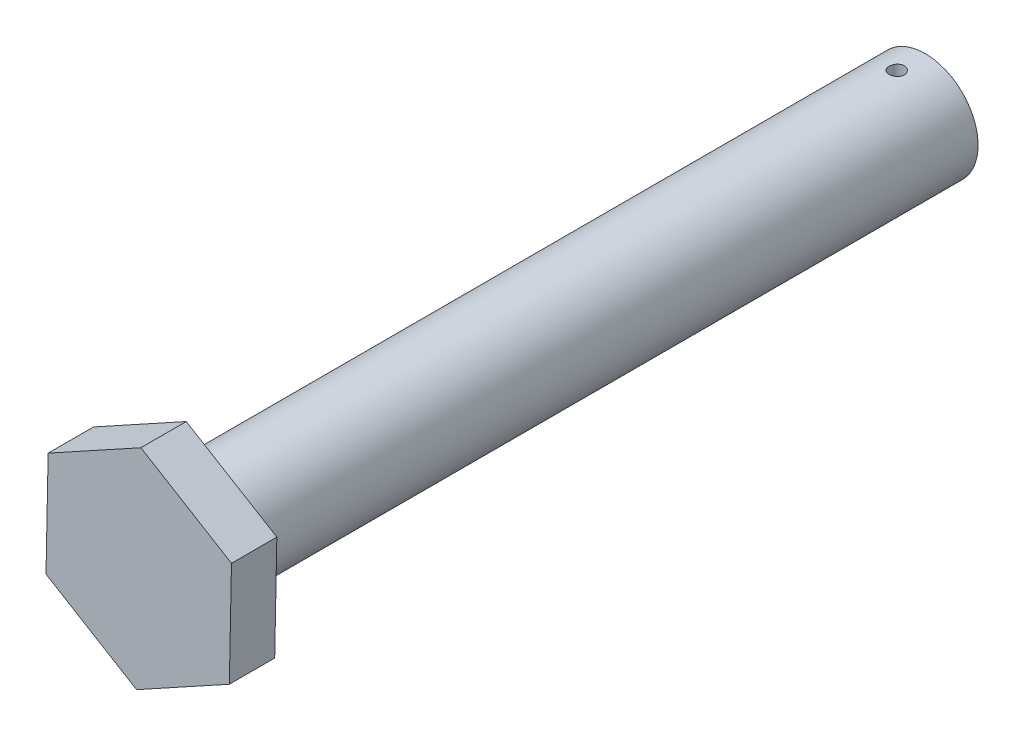
ISO-10303-21;
HEADER;
FILE_DESCRIPTION(('STEP AP214'),'2;1');
FILE_NAME('part.step','',(''),(''),'','','');
FILE_SCHEMA(('AUTOMOTIVE_DESIGN { 1 0 10303 214 1 1 1 1 }'));
ENDSEC;
DATA;
#1=APPLICATION_CONTEXT('core data for automotive mechanical design processes');
#2=APPLICATION_PROTOCOL_DEFINITION('international standard','automotive_design',2000,#1);
#3=PRODUCT_CONTEXT('',#1,'mechanical');
#4=PRODUCT('Part','Part','',(#3));
#5=PRODUCT_RELATED_PRODUCT_CATEGORY('part','',(#4));
#6=PRODUCT_DEFINITION_FORMATION('','',#4);
#7=PRODUCT_DEFINITION_CONTEXT('part definition',#1,'design');
#8=PRODUCT_DEFINITION('design','',#6,#7);
#9=PRODUCT_DEFINITION_SHAPE('','',#8);
#10=(LENGTH_UNIT() NAMED_UNIT(*) SI_UNIT(.MILLI.,.METRE.));
#11=(NAMED_UNIT(*) PLANE_ANGLE_UNIT() SI_UNIT($,.RADIAN.));
#12=(NAMED_UNIT(*) SI_UNIT($,.STERADIAN.) SOLID_ANGLE_UNIT());
#13=UNCERTAINTY_MEASURE_WITH_UNIT(LENGTH_MEASURE(1.E-05),#10,'distance_accuracy_value','');
#14=(GEOMETRIC_REPRESENTATION_CONTEXT(3) GLOBAL_UNCERTAINTY_ASSIGNED_CONTEXT((#13)) GLOBAL_UNIT_ASSIGNED_CONTEXT((#10,
#11,#12)) REPRESENTATION_CONTEXT('',''));
#15=CARTESIAN_POINT('',(0.,0.,0.));
#16=DIRECTION('',(0.,0.,1.));
#17=DIRECTION('',(1.,0.,0.));
#18=AXIS2_PLACEMENT_3D('',#15,#16,#17);
#19=CARTESIAN_POINT('',(0.,0.,46.));
#20=DIRECTION('',(0.,0.,-1.));
#21=DIRECTION('',(-1.,0.,0.));
#22=AXIS2_PLACEMENT_3D('',#19,#20,#21);
#23=CYLINDRICAL_SURFACE('',#22,3.5);
#24=CARTESIAN_POINT('',(0.,-3.5,-0.612079682125669));
#25=CARTESIAN_POINT('',(0.0279326823532053,-3.49999956761441,-0.612080845420074));
#26=CARTESIAN_POINT('',(0.0558819527477583,-3.49966210100148,-0.61442828570537));
#27=CARTESIAN_POINT('',(0.11100033018404,-3.49834835252939,-0.623754250242666));
#28=CARTESIAN_POINT('',(0.138168632766739,-3.49737143498153,-0.630737383010859));
#29=CARTESIAN_POINT('',(0.190919338392721,-3.49488865080911,-0.649122712992783));
#30=CARTESIAN_POINT('',(0.216502884674885,-3.49338317084148,-0.660521680538921));
#31=CARTESIAN_POINT('',(0.265389825120159,-3.49000994540293,-0.687407453573347));
#32=CARTESIAN_POINT('',(0.288693557719325,-3.48814225382512,-0.702893651050459));
#33=CARTESIAN_POINT('',(0.332529325198656,-3.48423769560446,-0.737631767709302));
#34=CARTESIAN_POINT('',(0.353042795400325,-3.48219982883739,-0.756907003554626));
#35=CARTESIAN_POINT('',(0.390555645884314,-3.47819249910609,-0.798625889395497));
#36=CARTESIAN_POINT('',(0.407554831354348,-3.47622303993902,-0.821069714923929));
#37=CARTESIAN_POINT('',(0.437627938211114,-3.47256578245342,-0.868612240152546));
#38=CARTESIAN_POINT('',(0.450684062736942,-3.47087927599814,-0.893722305268245));
#39=CARTESIAN_POINT('',(0.472386725834049,-3.46799241328143,-0.945806951871196));
#40=CARTESIAN_POINT('',(0.481033482272492,-3.46679203300108,-0.97278144116233));
#41=CARTESIAN_POINT('',(0.493614660030584,-3.46502309688297,-1.02763468703968));
#42=CARTESIAN_POINT('',(0.497580744263977,-3.46445029761801,-1.05550604208958));
#43=CARTESIAN_POINT('',(0.500786050037842,-3.46398846922711,-1.11152413484307));
#44=CARTESIAN_POINT('',(0.500025518134895,-3.46409940443521,-1.13967085810603));
#45=CARTESIAN_POINT('',(0.493825090489705,-3.46498862885515,-1.1952179547922));
#46=CARTESIAN_POINT('',(0.488420340898247,-3.4657619055106,-1.22262234314859));
#47=CARTESIAN_POINT('',(0.473139861607143,-3.46788085844754,-1.2761312252678));
#48=CARTESIAN_POINT('',(0.463264016237406,-3.4692265495377,-1.30223568538125));
#49=CARTESIAN_POINT('',(0.439284760624768,-3.47234428867639,-1.35251131867988));
#50=CARTESIAN_POINT('',(0.42516634655817,-3.47411784540628,-1.37667523831857));
#51=CARTESIAN_POINT('',(0.39311342286019,-3.47789036945032,-1.42230428822032));
#52=CARTESIAN_POINT('',(0.375178685756276,-3.47988935019758,-1.44376925749064));
#53=CARTESIAN_POINT('',(0.335808729357195,-3.48390967840225,-1.48359488368298));
#54=CARTESIAN_POINT('',(0.314343268788805,-3.48593106442266,-1.50192565465565));
#55=CARTESIAN_POINT('',(0.268624579700444,-3.48975158947797,-1.5347289327373));
#56=CARTESIAN_POINT('',(0.244371340936245,-3.49155072769612,-1.54920142566765));
#57=CARTESIAN_POINT('',(0.193740519906922,-3.49472567656735,-1.57387840087531));
#58=CARTESIAN_POINT('',(0.167361863866827,-3.4961012715301,-1.58408070949924));
#59=CARTESIAN_POINT('',(0.113241674688549,-3.49827229973009,-1.59990241678554));
#60=CARTESIAN_POINT('',(0.0855002251578205,-3.49906776851079,-1.60552209622112));
#61=CARTESIAN_POINT('',(0.0297000055974864,-3.49998423643184,-1.61197958883078));
#62=CARTESIAN_POINT('',(0.00164608488559785,-3.5001110340612,-1.61285851374279));
#63=CARTESIAN_POINT('',(-0.0542087125783237,-3.49969161816925,-1.60991848012065));
#64=CARTESIAN_POINT('',(-0.0820095963940144,-3.49914542349329,-1.6060996531344));
#65=CARTESIAN_POINT('',(-0.136445604496122,-3.49744498433075,-1.59390669672699));
#66=CARTESIAN_POINT('',(-0.16308527623003,-3.49629339682522,-1.58555246733078));
#67=CARTESIAN_POINT('',(-0.21458573600617,-3.49351093568108,-1.56454674730181));
#68=CARTESIAN_POINT('',(-0.23944644727027,-3.49188004137158,-1.55189507133088));
#69=CARTESIAN_POINT('',(-0.286864923949464,-3.48830594292734,-1.5225562278788));
#70=CARTESIAN_POINT('',(-0.309406303174492,-3.48636073712302,-1.5058428246993));
#71=CARTESIAN_POINT('',(-0.351378823701215,-3.48238111607694,-1.4688916631126));
#72=CARTESIAN_POINT('',(-0.370809801769645,-3.48034669616037,-1.4486537198545));
#73=CARTESIAN_POINT('',(-0.406158411551917,-3.47639970042426,-1.40504550688455));
#74=CARTESIAN_POINT('',(-0.422048575212094,-3.47448815387127,-1.38165286455054));
#75=CARTESIAN_POINT('',(-0.449673921884786,-3.47102117870203,-1.33250638547467));
#76=CARTESIAN_POINT('',(-0.461409208762707,-3.46946574118395,-1.30675260777776));
#77=CARTESIAN_POINT('',(-0.480348526896333,-3.4668944256544,-1.2536988559991));
#78=CARTESIAN_POINT('',(-0.487567325329926,-3.46587679094809,-1.22640424241534));
#79=CARTESIAN_POINT('',(-0.497315933000383,-3.46449152316109,-1.17097454186177));
#80=CARTESIAN_POINT('',(-0.499846033482548,-3.46412384970718,-1.14283950720625));
#81=CARTESIAN_POINT('',(-0.500138975935527,-3.46408154436269,-1.08680122549535));
#82=CARTESIAN_POINT('',(-0.497944993419515,-3.46440063580794,-1.05889819921184));
#83=CARTESIAN_POINT('',(-0.488944239626999,-3.46568231052995,-1.00386215111105));
#84=CARTESIAN_POINT('',(-0.482137473103377,-3.46664489314367,-0.976729128500411));
#85=CARTESIAN_POINT('',(-0.46411911391449,-3.46910297369378,-0.924013365847873));
#86=CARTESIAN_POINT('',(-0.452910257406503,-3.47059814054422,-0.898429674184908));
#87=CARTESIAN_POINT('',(-0.426410160507718,-3.47395336431846,-0.849499070887317));
#88=CARTESIAN_POINT('',(-0.411118807979599,-3.47581343126489,-0.826152220717821));
#89=CARTESIAN_POINT('',(-0.376729868657738,-3.47970915663223,-0.782138227493441));
#90=CARTESIAN_POINT('',(-0.357600232350913,-3.48174620565913,-0.76149624582511));
#91=CARTESIAN_POINT('',(-0.316145378330288,-3.48575455513516,-0.723699755267611));
#92=CARTESIAN_POINT('',(-0.293819416083736,-3.48772584013333,-0.706546061178546));
#93=CARTESIAN_POINT('',(-0.246475856133461,-3.49139165623141,-0.676137789116632));
#94=CARTESIAN_POINT('',(-0.221445429363574,-3.49308476279883,-0.662903018586195));
#95=CARTESIAN_POINT('',(-0.169505322092509,-3.49598939018721,-0.640844746124144));
#96=CARTESIAN_POINT('',(-0.142597651299745,-3.49720141700771,-0.632016606767573));
#97=CARTESIAN_POINT('',(-0.0963028409993892,-3.49872590751262,-0.621058785397513));
#98=CARTESIAN_POINT('',(-0.0772034747946432,-3.49920127714115,-0.617696672891108));
#99=CARTESIAN_POINT('',(-0.0387387303414156,-3.49983847164448,-0.613206729853618));
#100=CARTESIAN_POINT('',(-0.0193733549557654,-3.50000029989098,-0.612078875296051));
#101=CARTESIAN_POINT('',(0.,-3.5,-0.612079682125669));
#102=B_SPLINE_CURVE_WITH_KNOTS('',3,(#24,#25,#26,#27,#28,#29,#30,#31,#32,#33,#34,#35,#36,#37,
#38,#39,#40,#41,#42,#43,#44,#45,#46,#47,#48,#49,#50,#51,#52,#53,#54,#55,#56,#57,#58,#59,#60,#61,
#62,#63,#64,#65,#66,#67,#68,#69,#70,#71,#72,#73,#74,#75,#76,#77,#78,#79,#80,#81,#82,#83,#84,#85,
#86,#87,#88,#89,#90,#91,#92,#93,#94,#95,#96,#97,#98,#99,#100,#101),.UNSPECIFIED.,.T.,.F.,(4,2,2,
2,2,2,2,2,2,2,2,2,2,2,2,2,2,2,2,2,2,2,2,2,2,2,2,2,2,2,2,2,2,2,2,2,2,2,4),(0.,0.0837272633382192,
0.167537887997918,0.251287330348426,0.335024321252585,0.419293717144034,0.503567783207469,
0.588216720212788,0.672861474303291,0.756930296604885,0.840994733623897,0.924428541449303,
1.00786450788373,1.09159908905475,1.17533866263732,1.25983689176674,1.34433543141115,
1.42887693121915,1.51341325086312,1.59721528021521,1.68101496297015,1.76444989434235,
1.84788842451248,1.93188093996657,2.01587786188791,2.10050531181173,2.18513064603257,
2.26947782185212,2.35381975814838,2.4373941296178,2.5209684149747,2.60449083601271,
2.68801555146676,2.77226911877369,2.85654234362278,2.94123451249828,3.02583736461534,
3.0839089602894,3.14197993147703),.UNSPECIFIED.);
#103=CARTESIAN_POINT('',(0.,-3.5,-0.612079682125669));
#104=VERTEX_POINT('',#103);
#105=EDGE_CURVE('E37',#104,#104,#102,.T.);
#106=ORIENTED_EDGE('',*,*,#105,.T.);
#107=EDGE_LOOP('',(#106));
#108=FACE_BOUND('',#107,.T.);
#109=CARTESIAN_POINT('',(0.,3.5,-0.612079682125669));
#110=CARTESIAN_POINT('',(-0.0279326823532053,3.49999956761441,-0.612080845420074));
#111=CARTESIAN_POINT('',(-0.0558819527477583,3.49966210100148,-0.61442828570537));
#112=CARTESIAN_POINT('',(-0.11100033018404,3.49834835252939,-0.623754250242666));
#113=CARTESIAN_POINT('',(-0.138168632766739,3.49737143498153,-0.630737383010859));
#114=CARTESIAN_POINT('',(-0.190919338392721,3.49488865080911,-0.649122712992783));
#115=CARTESIAN_POINT('',(-0.216502884674885,3.49338317084148,-0.660521680538921));
#116=CARTESIAN_POINT('',(-0.265389825120159,3.49000994540293,-0.687407453573347));
#117=CARTESIAN_POINT('',(-0.288693557719325,3.48814225382512,-0.702893651050459));
#118=CARTESIAN_POINT('',(-0.332529325198656,3.48423769560446,-0.737631767709302));
#119=CARTESIAN_POINT('',(-0.353042795400325,3.48219982883739,-0.756907003554626));
#120=CARTESIAN_POINT('',(-0.390555645884314,3.47819249910609,-0.798625889395497));
#121=CARTESIAN_POINT('',(-0.407554831354348,3.47622303993902,-0.821069714923929));
#122=CARTESIAN_POINT('',(-0.437627938211114,3.47256578245342,-0.868612240152546));
#123=CARTESIAN_POINT('',(-0.450684062736942,3.47087927599814,-0.893722305268245));
#124=CARTESIAN_POINT('',(-0.472386725834049,3.46799241328143,-0.945806951871196));
#125=CARTESIAN_POINT('',(-0.481033482272492,3.46679203300108,-0.97278144116233));
#126=CARTESIAN_POINT('',(-0.493614660030584,3.46502309688297,-1.02763468703968));
#127=CARTESIAN_POINT('',(-0.497580744263977,3.46445029761801,-1.05550604208958));
#128=CARTESIAN_POINT('',(-0.500786050037842,3.46398846922711,-1.11152413484307));
#129=CARTESIAN_POINT('',(-0.500025518134895,3.46409940443521,-1.13967085810603));
#130=CARTESIAN_POINT('',(-0.493825090489705,3.46498862885515,-1.1952179547922));
#131=CARTESIAN_POINT('',(-0.488420340898247,3.4657619055106,-1.22262234314859));
#132=CARTESIAN_POINT('',(-0.473139861607143,3.46788085844754,-1.2761312252678));
#133=CARTESIAN_POINT('',(-0.463264016237406,3.4692265495377,-1.30223568538125));
#134=CARTESIAN_POINT('',(-0.439284760624768,3.47234428867639,-1.35251131867988));
#135=CARTESIAN_POINT('',(-0.42516634655817,3.47411784540628,-1.37667523831857));
#136=CARTESIAN_POINT('',(-0.39311342286019,3.47789036945032,-1.42230428822032));
#137=CARTESIAN_POINT('',(-0.375178685756276,3.47988935019758,-1.44376925749064));
#138=CARTESIAN_POINT('',(-0.335808729357195,3.48390967840225,-1.48359488368298));
#139=CARTESIAN_POINT('',(-0.314343268788805,3.48593106442266,-1.50192565465565));
#140=CARTESIAN_POINT('',(-0.268624579700444,3.48975158947797,-1.5347289327373));
#141=CARTESIAN_POINT('',(-0.244371340936245,3.49155072769612,-1.54920142566765));
#142=CARTESIAN_POINT('',(-0.193740519906922,3.49472567656735,-1.57387840087531));
#143=CARTESIAN_POINT('',(-0.167361863866827,3.4961012715301,-1.58408070949924));
#144=CARTESIAN_POINT('',(-0.113241674688549,3.49827229973009,-1.59990241678554));
#145=CARTESIAN_POINT('',(-0.0855002251578205,3.49906776851079,-1.60552209622112));
#146=CARTESIAN_POINT('',(-0.0297000055974864,3.49998423643184,-1.61197958883078));
#147=CARTESIAN_POINT('',(-0.00164608488559785,3.5001110340612,-1.61285851374279));
#148=CARTESIAN_POINT('',(0.0542087125783237,3.49969161816925,-1.60991848012065));
#149=CARTESIAN_POINT('',(0.0820095963940144,3.49914542349329,-1.6060996531344));
#150=CARTESIAN_POINT('',(0.136445604496122,3.49744498433075,-1.59390669672699));
#151=CARTESIAN_POINT('',(0.16308527623003,3.49629339682522,-1.58555246733078));
#152=CARTESIAN_POINT('',(0.21458573600617,3.49351093568108,-1.56454674730181));
#153=CARTESIAN_POINT('',(0.23944644727027,3.49188004137158,-1.55189507133088));
#154=CARTESIAN_POINT('',(0.286864923949464,3.48830594292734,-1.5225562278788));
#155=CARTESIAN_POINT('',(0.309406303174492,3.48636073712302,-1.5058428246993));
#156=CARTESIAN_POINT('',(0.351378823701215,3.48238111607694,-1.4688916631126));
#157=CARTESIAN_POINT('',(0.370809801769645,3.48034669616037,-1.4486537198545));
#158=CARTESIAN_POINT('',(0.406158411551917,3.47639970042426,-1.40504550688455));
#159=CARTESIAN_POINT('',(0.422048575212094,3.47448815387127,-1.38165286455054));
#160=CARTESIAN_POINT('',(0.449673921884786,3.47102117870203,-1.33250638547467));
#161=CARTESIAN_POINT('',(0.461409208762707,3.46946574118395,-1.30675260777776));
#162=CARTESIAN_POINT('',(0.480348526896333,3.4668944256544,-1.2536988559991));
#163=CARTESIAN_POINT('',(0.487567325329926,3.46587679094809,-1.22640424241534));
#164=CARTESIAN_POINT('',(0.497315933000383,3.46449152316109,-1.17097454186177));
#165=CARTESIAN_POINT('',(0.499846033482548,3.46412384970718,-1.14283950720625));
#166=CARTESIAN_POINT('',(0.500138975935527,3.46408154436269,-1.08680122549535));
#167=CARTESIAN_POINT('',(0.497944993419515,3.46440063580794,-1.05889819921184));
#168=CARTESIAN_POINT('',(0.488944239626999,3.46568231052995,-1.00386215111105));
#169=CARTESIAN_POINT('',(0.482137473103377,3.46664489314367,-0.976729128500411));
#170=CARTESIAN_POINT('',(0.46411911391449,3.46910297369378,-0.924013365847873));
#171=CARTESIAN_POINT('',(0.452910257406503,3.47059814054422,-0.898429674184908));
#172=CARTESIAN_POINT('',(0.426410160507718,3.47395336431846,-0.849499070887317));
#173=CARTESIAN_POINT('',(0.411118807979599,3.47581343126489,-0.826152220717821));
#174=CARTESIAN_POINT('',(0.376729868657738,3.47970915663223,-0.782138227493441));
#175=CARTESIAN_POINT('',(0.357600232350913,3.48174620565913,-0.76149624582511));
#176=CARTESIAN_POINT('',(0.316145378330288,3.48575455513516,-0.723699755267611));
#177=CARTESIAN_POINT('',(0.293819416083736,3.48772584013333,-0.706546061178546));
#178=CARTESIAN_POINT('',(0.246475856133461,3.49139165623141,-0.676137789116632));
#179=CARTESIAN_POINT('',(0.221445429363574,3.49308476279883,-0.662903018586195));
#180=CARTESIAN_POINT('',(0.169505322092509,3.49598939018721,-0.640844746124144));
#181=CARTESIAN_POINT('',(0.142597651299745,3.49720141700771,-0.632016606767573));
#182=CARTESIAN_POINT('',(0.0963028409993892,3.49872590751262,-0.621058785397513));
#183=CARTESIAN_POINT('',(0.0772034747946432,3.49920127714115,-0.617696672891108));
#184=CARTESIAN_POINT('',(0.0387387303414156,3.49983847164448,-0.613206729853618));
#185=CARTESIAN_POINT('',(0.0193733549557654,3.50000029989098,-0.612078875296051));
#186=CARTESIAN_POINT('',(0.,3.5,-0.612079682125669));
#187=B_SPLINE_CURVE_WITH_KNOTS('',3,(#109,#110,#111,#112,#113,#114,#115,#116,#117,#118,#119,
#120,#121,#122,#123,#124,#125,#126,#127,#128,#129,#130,#131,#132,#133,#134,#135,#136,#137,#138,
#139,#140,#141,#142,#143,#144,#145,#146,#147,#148,#149,#150,#151,#152,#153,#154,#155,#156,#157,
#158,#159,#160,#161,#162,#163,#164,#165,#166,#167,#168,#169,#170,#171,#172,#173,#174,#175,#176,
#177,#178,#179,#180,#181,#182,#183,#184,#185,#186),.UNSPECIFIED.,.T.,.F.,(4,2,2,2,2,2,2,2,2,2,2,
2,2,2,2,2,2,2,2,2,2,2,2,2,2,2,2,2,2,2,2,2,2,2,2,2,2,2,4),(0.,0.0837272633382192,
0.167537887997918,0.251287330348426,0.335024321252585,0.419293717144034,0.503567783207469,
0.588216720212788,0.672861474303291,0.756930296604885,0.840994733623897,0.924428541449303,
1.00786450788373,1.09159908905475,1.17533866263732,1.25983689176674,1.34433543141115,
1.42887693121915,1.51341325086312,1.59721528021521,1.68101496297015,1.76444989434235,
1.84788842451248,1.93188093996657,2.01587786188791,2.10050531181173,2.18513064603257,
2.26947782185212,2.35381975814838,2.4373941296178,2.5209684149747,2.60449083601271,
2.68801555146676,2.77226911877369,2.85654234362278,2.94123451249828,3.02583736461534,
3.0839089602894,3.14197993147703),.UNSPECIFIED.);
#188=CARTESIAN_POINT('',(0.,3.5,-0.612079682125669));
#189=VERTEX_POINT('',#188);
#190=EDGE_CURVE('E143',#189,#189,#187,.T.);
#191=ORIENTED_EDGE('',*,*,#190,.T.);
#192=EDGE_LOOP('',(#191));
#193=FACE_BOUND('',#192,.T.);
#194=CARTESIAN_POINT('',(0.,0.,46.));
#195=DIRECTION('',(0.,0.,1.));
#196=DIRECTION('',(1.,0.,0.));
#197=AXIS2_PLACEMENT_3D('',#194,#195,#196);
#198=CIRCLE('',#197,3.5);
#199=CARTESIAN_POINT('',(3.5,0.,46.));
#200=VERTEX_POINT('',#199);
#201=EDGE_CURVE('E11',#200,#200,#198,.T.);
#202=ORIENTED_EDGE('',*,*,#201,.F.);
#203=EDGE_LOOP('',(#202));
#204=FACE_BOUND('',#203,.T.);
#205=CARTESIAN_POINT('',(0.,0.,-3.));
#206=DIRECTION('',(0.,0.,-1.));
#207=DIRECTION('',(-1.,0.,0.));
#208=AXIS2_PLACEMENT_3D('',#205,#206,#207);
#209=CIRCLE('',#208,3.5);
#210=CARTESIAN_POINT('',(-3.5,0.,-3.));
#211=VERTEX_POINT('',#210);
#212=EDGE_CURVE('E129',#211,#211,#209,.T.);
#213=ORIENTED_EDGE('',*,*,#212,.F.);
#214=EDGE_LOOP('',(#213));
#215=FACE_BOUND('',#214,.T.);
#216=ADVANCED_FACE('F33',(#108,#193,#204,#215),#23,.T.);
#217=CARTESIAN_POINT('',(6.13194865336812,3.37627097734422,49.));
#218=DIRECTION('',(-0.517469688549495,-0.855701537589181,0.));
#219=DIRECTION('',(0.855701537589181,-0.517469688549495,0.));
#220=AXIS2_PLACEMENT_3D('',#217,#218,#219);
#221=PLANE('',#220);
#222=DIRECTION('',(-0.855701537589181,0.517469688549495,0.));
#223=VECTOR('',#222,1.);
#224=CARTESIAN_POINT('',(6.13194865336812,3.37627097734422,46.));
#225=LINE('',#224,#223);
#226=CARTESIAN_POINT('',(6.13194865336812,3.37627097734422,46.));
#227=VERTEX_POINT('',#226);
#228=CARTESIAN_POINT('',(0.142037890243855,6.99855879719068,46.));
#229=VERTEX_POINT('',#228);
#230=EDGE_CURVE('E125',#227,#229,#225,.T.);
#231=ORIENTED_EDGE('',*,*,#230,.T.);
#232=DIRECTION('',(0.,0.,-1.));
#233=VECTOR('',#232,1.);
#234=CARTESIAN_POINT('',(0.142037890243855,6.99855879719068,49.));
#235=LINE('',#234,#233);
#236=CARTESIAN_POINT('',(0.142037890243855,6.99855879719068,49.));
#237=VERTEX_POINT('',#236);
#238=EDGE_CURVE('E47',#237,#229,#235,.T.);
#239=ORIENTED_EDGE('',*,*,#238,.F.);
#240=DIRECTION('',(-0.855701537589181,0.517469688549495,0.));
#241=VECTOR('',#240,1.);
#242=CARTESIAN_POINT('',(6.13194865336812,3.37627097734422,49.));
#243=LINE('',#242,#241);
#244=CARTESIAN_POINT('',(6.13194865336812,3.37627097734422,49.));
#245=VERTEX_POINT('',#244);
#246=EDGE_CURVE('E136',#245,#237,#243,.T.);
#247=ORIENTED_EDGE('',*,*,#246,.F.);
#248=DIRECTION('',(0.,0.,-1.));
#249=VECTOR('',#248,1.);
#250=CARTESIAN_POINT('',(6.13194865336812,3.37627097734422,49.));
#251=LINE('',#250,#249);
#252=EDGE_CURVE('E121',#245,#227,#251,.T.);
#253=ORIENTED_EDGE('',*,*,#252,.T.);
#254=EDGE_LOOP('',(#231,#239,#247,#253));
#255=FACE_BOUND('',#254,.T.);
#256=ADVANCED_FACE('F177',(#255),#221,.F.);
#257=CARTESIAN_POINT('',(0.142037890243855,6.99855879719068,49.));
#258=DIRECTION('',(0.482324425334888,-0.875992664766875,0.));
#259=DIRECTION('',(0.875992664766875,0.482324425334888,0.));
#260=AXIS2_PLACEMENT_3D('',#257,#258,#259);
#261=PLANE('',#260);
#262=DIRECTION('',(-0.875992664766875,-0.482324425334888,0.));
#263=VECTOR('',#262,1.);
#264=CARTESIAN_POINT('',(0.142037890243855,6.99855879719068,46.));
#265=LINE('',#264,#263);
#266=CARTESIAN_POINT('',(-5.98991076312427,3.62228781984647,46.));
#267=VERTEX_POINT('',#266);
#268=EDGE_CURVE('E128',#229,#267,#265,.T.);
#269=ORIENTED_EDGE('',*,*,#268,.T.);
#270=DIRECTION('',(0.,0.,-1.));
#271=VECTOR('',#270,1.);
#272=CARTESIAN_POINT('',(-5.98991076312427,3.62228781984647,49.));
#273=LINE('',#272,#271);
#274=CARTESIAN_POINT('',(-5.98991076312427,3.62228781984647,49.));
#275=VERTEX_POINT('',#274);
#276=EDGE_CURVE('E140',#275,#267,#273,.T.);
#277=ORIENTED_EDGE('',*,*,#276,.F.);
#278=DIRECTION('',(-0.875992664766875,-0.482324425334888,0.));
#279=VECTOR('',#278,1.);
#280=CARTESIAN_POINT('',(0.142037890243855,6.99855879719068,49.));
#281=LINE('',#280,#279);
#282=EDGE_CURVE('E94',#237,#275,#281,.T.);
#283=ORIENTED_EDGE('',*,*,#282,.F.);
#284=ORIENTED_EDGE('',*,*,#238,.T.);
#285=EDGE_LOOP('',(#269,#277,#283,#284));
#286=FACE_BOUND('',#285,.T.);
#287=ADVANCED_FACE('F174',(#286),#261,.F.);
#288=CARTESIAN_POINT('',(-5.98991076312427,3.62228781984647,49.));
#289=DIRECTION('',(0.999794113884383,-0.0202911271776935,0.));
#290=DIRECTION('',(0.0202911271776935,0.999794113884383,0.));
#291=AXIS2_PLACEMENT_3D('',#288,#289,#290);
#292=PLANE('',#291);
#293=DIRECTION('',(-0.0202911271776935,-0.999794113884383,0.));
#294=VECTOR('',#293,1.);
#295=CARTESIAN_POINT('',(-5.98991076312427,3.62228781984647,46.));
#296=LINE('',#295,#294);
#297=CARTESIAN_POINT('',(-6.13194865336812,-3.37627097734422,46.));
#298=VERTEX_POINT('',#297);
#299=EDGE_CURVE('E131',#267,#298,#296,.T.);
#300=ORIENTED_EDGE('',*,*,#299,.T.);
#301=DIRECTION('',(0.,0.,-1.));
#302=VECTOR('',#301,1.);
#303=CARTESIAN_POINT('',(-6.13194865336812,-3.37627097734422,49.));
#304=LINE('',#303,#302);
#305=CARTESIAN_POINT('',(-6.13194865336812,-3.37627097734422,49.));
#306=VERTEX_POINT('',#305);
#307=EDGE_CURVE('E116',#306,#298,#304,.T.);
#308=ORIENTED_EDGE('',*,*,#307,.F.);
#309=DIRECTION('',(-0.0202911271776935,-0.999794113884383,0.));
#310=VECTOR('',#309,1.);
#311=CARTESIAN_POINT('',(-5.98991076312427,3.62228781984647,49.));
#312=LINE('',#311,#310);
#313=EDGE_CURVE('E107',#275,#306,#312,.T.);
#314=ORIENTED_EDGE('',*,*,#313,.F.);
#315=ORIENTED_EDGE('',*,*,#276,.T.);
#316=EDGE_LOOP('',(#300,#308,#314,#315));
#317=FACE_BOUND('',#316,.T.);
#318=ADVANCED_FACE('F171',(#317),#292,.F.);
#319=CARTESIAN_POINT('',(-6.13194865336812,-3.37627097734422,49.));
#320=DIRECTION('',(0.517469688549495,0.855701537589181,0.));
#321=DIRECTION('',(-0.855701537589181,0.517469688549495,0.));
#322=AXIS2_PLACEMENT_3D('',#319,#320,#321);
#323=PLANE('',#322);
#324=DIRECTION('',(0.855701537589181,-0.517469688549495,0.));
#325=VECTOR('',#324,1.);
#326=CARTESIAN_POINT('',(-6.13194865336812,-3.37627097734422,46.));
#327=LINE('',#326,#325);
#328=CARTESIAN_POINT('',(-0.142037890243854,-6.99855879719068,46.));
#329=VERTEX_POINT('',#328);
#330=EDGE_CURVE('E115',#298,#329,#327,.T.);
#331=ORIENTED_EDGE('',*,*,#330,.T.);
#332=DIRECTION('',(0.,0.,-1.));
#333=VECTOR('',#332,1.);
#334=CARTESIAN_POINT('',(-0.142037890243854,-6.99855879719068,49.));
#335=LINE('',#334,#333);
#336=CARTESIAN_POINT('',(-0.142037890243854,-6.99855879719068,49.));
#337=VERTEX_POINT('',#336);
#338=EDGE_CURVE('E112',#337,#329,#335,.T.);
#339=ORIENTED_EDGE('',*,*,#338,.F.);
#340=DIRECTION('',(0.855701537589181,-0.517469688549495,0.));
#341=VECTOR('',#340,1.);
#342=CARTESIAN_POINT('',(-6.13194865336812,-3.37627097734422,49.));
#343=LINE('',#342,#341);
#344=EDGE_CURVE('E101',#306,#337,#343,.T.);
#345=ORIENTED_EDGE('',*,*,#344,.F.);
#346=ORIENTED_EDGE('',*,*,#307,.T.);
#347=EDGE_LOOP('',(#331,#339,#345,#346));
#348=FACE_BOUND('',#347,.T.);
#349=ADVANCED_FACE('F113',(#348),#323,.F.);
#350=CARTESIAN_POINT('',(-0.142037890243854,-6.99855879719068,49.));
#351=DIRECTION('',(-0.482324425334888,0.875992664766875,0.));
#352=DIRECTION('',(-0.875992664766875,-0.482324425334888,0.));
#353=AXIS2_PLACEMENT_3D('',#350,#351,#352);
#354=PLANE('',#353);
#355=DIRECTION('',(0.875992664766875,0.482324425334888,0.));
#356=VECTOR('',#355,1.);
#357=CARTESIAN_POINT('',(-0.142037890243854,-6.99855879719068,46.));
#358=LINE('',#357,#356);
#359=CARTESIAN_POINT('',(5.98991076312427,-3.62228781984647,46.));
#360=VERTEX_POINT('',#359);
#361=EDGE_CURVE('E79',#329,#360,#358,.T.);
#362=ORIENTED_EDGE('',*,*,#361,.T.);
#363=DIRECTION('',(0.,0.,-1.));
#364=VECTOR('',#363,1.);
#365=CARTESIAN_POINT('',(5.98991076312427,-3.62228781984647,49.));
#366=LINE('',#365,#364);
#367=CARTESIAN_POINT('',(5.98991076312427,-3.62228781984647,49.));
#368=VERTEX_POINT('',#367);
#369=EDGE_CURVE('E117',#368,#360,#366,.T.);
#370=ORIENTED_EDGE('',*,*,#369,.F.);
#371=DIRECTION('',(0.875992664766875,0.482324425334888,0.));
#372=VECTOR('',#371,1.);
#373=CARTESIAN_POINT('',(-0.142037890243854,-6.99855879719068,49.));
#374=LINE('',#373,#372);
#375=EDGE_CURVE('E105',#337,#368,#374,.T.);
#376=ORIENTED_EDGE('',*,*,#375,.F.);
#377=ORIENTED_EDGE('',*,*,#338,.T.);
#378=EDGE_LOOP('',(#362,#370,#376,#377));
#379=FACE_BOUND('',#378,.T.);
#380=ADVANCED_FACE('F119',(#379),#354,.F.);
#381=CARTESIAN_POINT('',(5.98991076312427,-3.62228781984647,49.));
#382=DIRECTION('',(-0.999794113884383,0.0202911271776936,0.));
#383=DIRECTION('',(-0.0202911271776936,-0.999794113884383,0.));
#384=AXIS2_PLACEMENT_3D('',#381,#382,#383);
#385=PLANE('',#384);
#386=DIRECTION('',(0.0202911271776936,0.999794113884383,0.));
#387=VECTOR('',#386,1.);
#388=CARTESIAN_POINT('',(5.98991076312427,-3.62228781984647,46.));
#389=LINE('',#388,#387);
#390=EDGE_CURVE('E85',#360,#227,#389,.T.);
#391=ORIENTED_EDGE('',*,*,#390,.T.);
#392=ORIENTED_EDGE('',*,*,#252,.F.);
#393=DIRECTION('',(0.0202911271776936,0.999794113884383,0.));
#394=VECTOR('',#393,1.);
#395=CARTESIAN_POINT('',(5.98991076312427,-3.62228781984647,49.));
#396=LINE('',#395,#394);
#397=EDGE_CURVE('E56',#368,#245,#396,.T.);
#398=ORIENTED_EDGE('',*,*,#397,.F.);
#399=ORIENTED_EDGE('',*,*,#369,.T.);
#400=EDGE_LOOP('',(#391,#392,#398,#399));
#401=FACE_BOUND('',#400,.T.);
#402=ADVANCED_FACE('F161',(#401),#385,.F.);
#403=CARTESIAN_POINT('',(0.,0.,49.));
#404=DIRECTION('',(0.,0.,1.));
#405=DIRECTION('',(1.,0.,0.));
#406=AXIS2_PLACEMENT_3D('',#403,#404,#405);
#407=PLANE('',#406);
#408=ORIENTED_EDGE('',*,*,#246,.T.);
#409=ORIENTED_EDGE('',*,*,#282,.T.);
#410=ORIENTED_EDGE('',*,*,#313,.T.);
#411=ORIENTED_EDGE('',*,*,#344,.T.);
#412=ORIENTED_EDGE('',*,*,#375,.T.);
#413=ORIENTED_EDGE('',*,*,#397,.T.);
#414=EDGE_LOOP('',(#408,#409,#410,#411,#412,#413));
#415=FACE_BOUND('',#414,.T.);
#416=ADVANCED_FACE('F103',(#415),#407,.T.);
#417=CARTESIAN_POINT('',(0.,0.,46.));
#418=DIRECTION('',(0.,0.,1.));
#419=DIRECTION('',(1.,0.,0.));
#420=AXIS2_PLACEMENT_3D('',#417,#418,#419);
#421=PLANE('',#420);
#422=ORIENTED_EDGE('',*,*,#201,.T.);
#423=EDGE_LOOP('',(#422));
#424=FACE_BOUND('',#423,.T.);
#425=ORIENTED_EDGE('',*,*,#230,.F.);
#426=ORIENTED_EDGE('',*,*,#390,.F.);
#427=ORIENTED_EDGE('',*,*,#361,.F.);
#428=ORIENTED_EDGE('',*,*,#330,.F.);
#429=ORIENTED_EDGE('',*,*,#299,.F.);
#430=ORIENTED_EDGE('',*,*,#268,.F.);
#431=EDGE_LOOP('',(#425,#426,#427,#428,#429,#430));
#432=FACE_BOUND('',#431,.T.);
#433=ADVANCED_FACE('F157',(#424,#432),#421,.F.);
#434=CARTESIAN_POINT('',(0.,0.,-3.));
#435=DIRECTION('',(0.,0.,-1.));
#436=DIRECTION('',(-1.,0.,0.));
#437=AXIS2_PLACEMENT_3D('',#434,#435,#436);
#438=PLANE('',#437);
#439=ORIENTED_EDGE('',*,*,#212,.T.);
#440=EDGE_LOOP('',(#439));
#441=FACE_BOUND('',#440,.T.);
#442=ADVANCED_FACE('F152',(#441),#438,.T.);
#443=CARTESIAN_POINT('',(0.,-15.,-1.11207968212567));
#444=DIRECTION('',(0.,1.,0.));
#445=DIRECTION('',(0.,0.,1.));
#446=AXIS2_PLACEMENT_3D('',#443,#444,#445);
#447=CYLINDRICAL_SURFACE('',#446,0.5);
#448=ORIENTED_EDGE('',*,*,#190,.F.);
#449=EDGE_LOOP('',(#448));
#450=FACE_BOUND('',#449,.T.);
#451=ORIENTED_EDGE('',*,*,#105,.F.);
#452=EDGE_LOOP('',(#451));
#453=FACE_BOUND('',#452,.T.);
#454=ADVANCED_FACE('F148',(#450,#453),#447,.F.);
#455=CLOSED_SHELL('',(#216,#256,#287,#318,#349,#380,#402,#416,#433,#442,#454));
#456=MANIFOLD_SOLID_BREP('B2',#455);
#457=ADVANCED_BREP_SHAPE_REPRESENTATION('',(#18,#456),#14);
#458=SHAPE_DEFINITION_REPRESENTATION(#9,#457);
ENDSEC;
END-ISO-10303-21;
